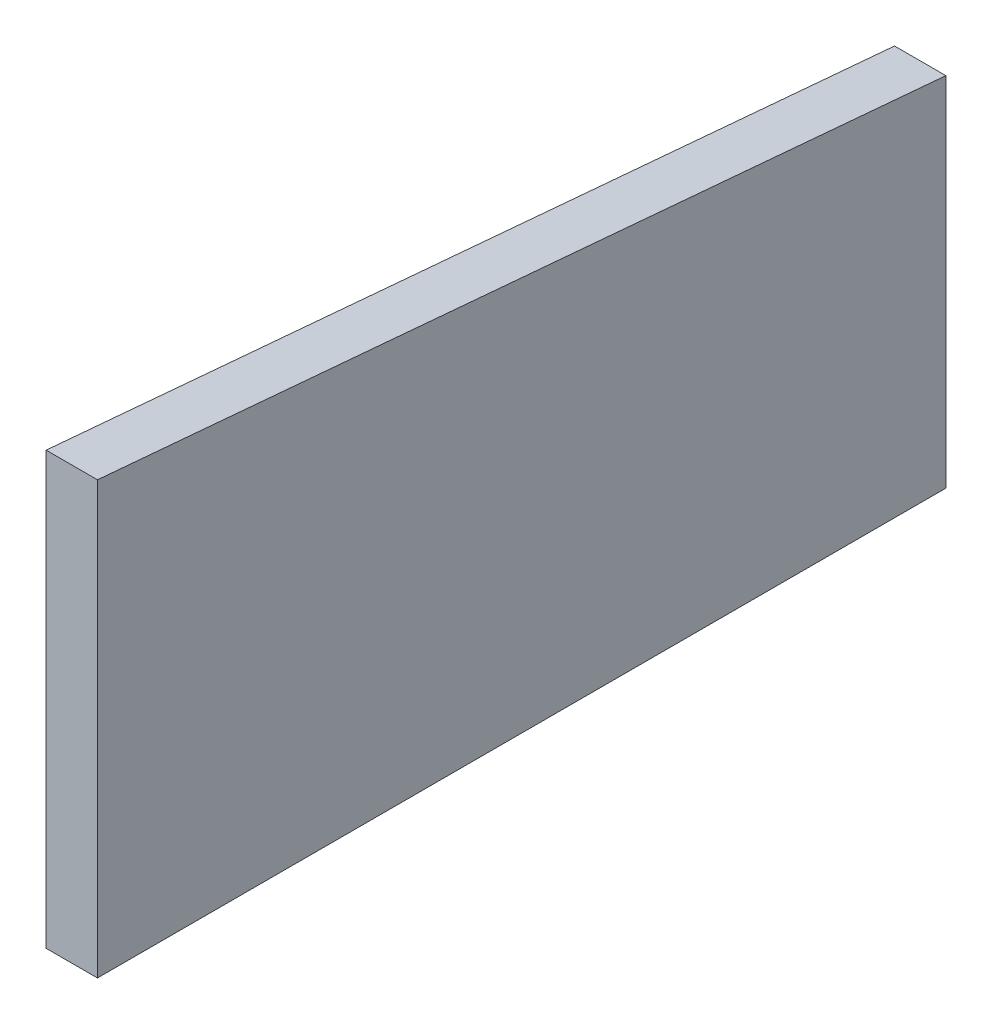
ISO-10303-21;
HEADER;
FILE_DESCRIPTION(('STEP AP214'),'2;1');
FILE_NAME('part.step','',(''),(''),'','','');
FILE_SCHEMA(('AUTOMOTIVE_DESIGN { 1 0 10303 214 1 1 1 1 }'));
ENDSEC;
DATA;
#1=APPLICATION_CONTEXT('core data for automotive mechanical design processes');
#2=APPLICATION_PROTOCOL_DEFINITION('international standard','automotive_design',2000,#1);
#3=PRODUCT_CONTEXT('',#1,'mechanical');
#4=PRODUCT('Part','Part','',(#3));
#5=PRODUCT_RELATED_PRODUCT_CATEGORY('part','',(#4));
#6=PRODUCT_DEFINITION_FORMATION('','',#4);
#7=PRODUCT_DEFINITION_CONTEXT('part definition',#1,'design');
#8=PRODUCT_DEFINITION('design','',#6,#7);
#9=PRODUCT_DEFINITION_SHAPE('','',#8);
#10=(LENGTH_UNIT() NAMED_UNIT(*) SI_UNIT(.MILLI.,.METRE.));
#11=(NAMED_UNIT(*) PLANE_ANGLE_UNIT() SI_UNIT($,.RADIAN.));
#12=(NAMED_UNIT(*) SI_UNIT($,.STERADIAN.) SOLID_ANGLE_UNIT());
#13=UNCERTAINTY_MEASURE_WITH_UNIT(LENGTH_MEASURE(1.E-05),#10,'distance_accuracy_value','');
#14=(GEOMETRIC_REPRESENTATION_CONTEXT(3) GLOBAL_UNCERTAINTY_ASSIGNED_CONTEXT((#13)) GLOBAL_UNIT_ASSIGNED_CONTEXT((#10,
#11,#12)) REPRESENTATION_CONTEXT('',''));
#15=CARTESIAN_POINT('',(0.,0.,0.));
#16=DIRECTION('',(0.,0.,1.));
#17=DIRECTION('',(1.,0.,0.));
#18=AXIS2_PLACEMENT_3D('',#15,#16,#17);
#19=CARTESIAN_POINT('',(18.25625,0.,0.));
#20=DIRECTION('',(0.,0.,-1.));
#21=DIRECTION('',(0.,1.,0.));
#22=AXIS2_PLACEMENT_3D('',#19,#20,#21);
#23=PLANE('',#22);
#24=DIRECTION('',(0.,-1.,0.));
#25=VECTOR('',#24,1.);
#26=CARTESIAN_POINT('',(0.,0.,0.));
#27=LINE('',#26,#25);
#28=CARTESIAN_POINT('',(0.,153.388768136008,0.));
#29=VERTEX_POINT('',#28);
#30=CARTESIAN_POINT('',(0.,0.,0.));
#31=VERTEX_POINT('',#30);
#32=EDGE_CURVE('E98',#29,#31,#27,.T.);
#33=ORIENTED_EDGE('',*,*,#32,.T.);
#34=DIRECTION('',(-1.,0.,0.));
#35=VECTOR('',#34,1.);
#36=CARTESIAN_POINT('',(18.25625,0.,0.));
#37=LINE('',#36,#35);
#38=CARTESIAN_POINT('',(18.25625,0.,0.));
#39=VERTEX_POINT('',#38);
#40=EDGE_CURVE('E11',#39,#31,#37,.T.);
#41=ORIENTED_EDGE('',*,*,#40,.F.);
#42=DIRECTION('',(0.,-1.,0.));
#43=VECTOR('',#42,1.);
#44=CARTESIAN_POINT('',(18.25625,0.,0.));
#45=LINE('',#44,#43);
#46=CARTESIAN_POINT('',(18.25625,153.388768136008,0.));
#47=VERTEX_POINT('',#46);
#48=EDGE_CURVE('E86',#47,#39,#45,.T.);
#49=ORIENTED_EDGE('',*,*,#48,.F.);
#50=DIRECTION('',(-1.,0.,0.));
#51=VECTOR('',#50,1.);
#52=CARTESIAN_POINT('',(18.25625,153.388768136008,0.));
#53=LINE('',#52,#51);
#54=EDGE_CURVE('E94',#47,#29,#53,.T.);
#55=ORIENTED_EDGE('',*,*,#54,.T.);
#56=EDGE_LOOP('',(#33,#41,#49,#55));
#57=FACE_BOUND('',#56,.T.);
#58=ADVANCED_FACE('F35',(#57),#23,.F.);
#59=CARTESIAN_POINT('',(18.25625,0.,0.));
#60=DIRECTION('',(0.,1.,0.));
#61=DIRECTION('',(0.,0.,1.));
#62=AXIS2_PLACEMENT_3D('',#59,#60,#61);
#63=PLANE('',#62);
#64=DIRECTION('',(0.,0.,-1.));
#65=VECTOR('',#64,1.);
#66=CARTESIAN_POINT('',(0.,0.,0.));
#67=LINE('',#66,#65);
#68=CARTESIAN_POINT('',(0.,0.,-301.625));
#69=VERTEX_POINT('',#68);
#70=EDGE_CURVE('E90',#31,#69,#67,.T.);
#71=ORIENTED_EDGE('',*,*,#70,.T.);
#72=DIRECTION('',(-1.,0.,0.));
#73=VECTOR('',#72,1.);
#74=CARTESIAN_POINT('',(18.25625,0.,-301.625));
#75=LINE('',#74,#73);
#76=CARTESIAN_POINT('',(18.25625,0.,-301.625));
#77=VERTEX_POINT('',#76);
#78=EDGE_CURVE('E43',#77,#69,#75,.T.);
#79=ORIENTED_EDGE('',*,*,#78,.F.);
#80=DIRECTION('',(0.,0.,-1.));
#81=VECTOR('',#80,1.);
#82=CARTESIAN_POINT('',(18.25625,0.,0.));
#83=LINE('',#82,#81);
#84=EDGE_CURVE('E81',#39,#77,#83,.T.);
#85=ORIENTED_EDGE('',*,*,#84,.F.);
#86=ORIENTED_EDGE('',*,*,#40,.T.);
#87=EDGE_LOOP('',(#71,#79,#85,#86));
#88=FACE_BOUND('',#87,.T.);
#89=ADVANCED_FACE('F89',(#88),#63,.F.);
#90=CARTESIAN_POINT('',(18.25625,127.,-301.625));
#91=DIRECTION('',(0.,0.,1.));
#92=DIRECTION('',(0.,-1.,0.));
#93=AXIS2_PLACEMENT_3D('',#90,#91,#92);
#94=PLANE('',#93);
#95=DIRECTION('',(0.,1.,0.));
#96=VECTOR('',#95,1.);
#97=CARTESIAN_POINT('',(0.,127.,-301.625));
#98=LINE('',#97,#96);
#99=CARTESIAN_POINT('',(0.,127.,-301.625));
#100=VERTEX_POINT('',#99);
#101=EDGE_CURVE('E68',#69,#100,#98,.T.);
#102=ORIENTED_EDGE('',*,*,#101,.T.);
#103=DIRECTION('',(-1.,0.,0.));
#104=VECTOR('',#103,1.);
#105=CARTESIAN_POINT('',(18.25625,127.,-301.625));
#106=LINE('',#105,#104);
#107=CARTESIAN_POINT('',(18.25625,127.,-301.625));
#108=VERTEX_POINT('',#107);
#109=EDGE_CURVE('E91',#108,#100,#106,.T.);
#110=ORIENTED_EDGE('',*,*,#109,.F.);
#111=DIRECTION('',(0.,1.,0.));
#112=VECTOR('',#111,1.);
#113=CARTESIAN_POINT('',(18.25625,127.,-301.625));
#114=LINE('',#113,#112);
#115=EDGE_CURVE('E84',#77,#108,#114,.T.);
#116=ORIENTED_EDGE('',*,*,#115,.F.);
#117=ORIENTED_EDGE('',*,*,#78,.T.);
#118=EDGE_LOOP('',(#102,#110,#116,#117));
#119=FACE_BOUND('',#118,.T.);
#120=ADVANCED_FACE('F92',(#119),#94,.F.);
#121=CARTESIAN_POINT('',(18.25625,153.388768136008,0.));
#122=DIRECTION('',(0.,-0.996194698091745,0.087155742747662));
#123=DIRECTION('',(0.,-0.087155742747662,-0.996194698091745));
#124=AXIS2_PLACEMENT_3D('',#121,#122,#123);
#125=PLANE('',#124);
#126=DIRECTION('',(0.,0.087155742747662,0.996194698091745));
#127=VECTOR('',#126,1.);
#128=CARTESIAN_POINT('',(0.,153.388768136008,0.));
#129=LINE('',#128,#127);
#130=EDGE_CURVE('E74',#100,#29,#129,.T.);
#131=ORIENTED_EDGE('',*,*,#130,.T.);
#132=ORIENTED_EDGE('',*,*,#54,.F.);
#133=DIRECTION('',(0.,0.087155742747662,0.996194698091745));
#134=VECTOR('',#133,1.);
#135=CARTESIAN_POINT('',(18.25625,153.388768136008,0.));
#136=LINE('',#135,#134);
#137=EDGE_CURVE('E51',#108,#47,#136,.T.);
#138=ORIENTED_EDGE('',*,*,#137,.F.);
#139=ORIENTED_EDGE('',*,*,#109,.T.);
#140=EDGE_LOOP('',(#131,#132,#138,#139));
#141=FACE_BOUND('',#140,.T.);
#142=ADVANCED_FACE('F105',(#141),#125,.F.);
#143=CARTESIAN_POINT('',(18.25625,0.,0.));
#144=DIRECTION('',(-1.,0.,0.));
#145=DIRECTION('',(0.,0.,1.));
#146=AXIS2_PLACEMENT_3D('',#143,#144,#145);
#147=PLANE('',#146);
#148=ORIENTED_EDGE('',*,*,#48,.T.);
#149=ORIENTED_EDGE('',*,*,#84,.T.);
#150=ORIENTED_EDGE('',*,*,#115,.T.);
#151=ORIENTED_EDGE('',*,*,#137,.T.);
#152=EDGE_LOOP('',(#148,#149,#150,#151));
#153=FACE_BOUND('',#152,.T.);
#154=ADVANCED_FACE('F82',(#153),#147,.F.);
#155=CARTESIAN_POINT('',(0.,0.,0.));
#156=DIRECTION('',(-1.,0.,0.));
#157=DIRECTION('',(0.,0.,1.));
#158=AXIS2_PLACEMENT_3D('',#155,#156,#157);
#159=PLANE('',#158);
#160=ORIENTED_EDGE('',*,*,#32,.F.);
#161=ORIENTED_EDGE('',*,*,#130,.F.);
#162=ORIENTED_EDGE('',*,*,#101,.F.);
#163=ORIENTED_EDGE('',*,*,#70,.F.);
#164=EDGE_LOOP('',(#160,#161,#162,#163));
#165=FACE_BOUND('',#164,.T.);
#166=ADVANCED_FACE('F108',(#165),#159,.T.);
#167=CLOSED_SHELL('',(#58,#89,#120,#142,#154,#166));
#168=MANIFOLD_SOLID_BREP('B2',#167);
#169=ADVANCED_BREP_SHAPE_REPRESENTATION('',(#18,#168),#14);
#170=SHAPE_DEFINITION_REPRESENTATION(#9,#169);
ENDSEC;
END-ISO-10303-21;
